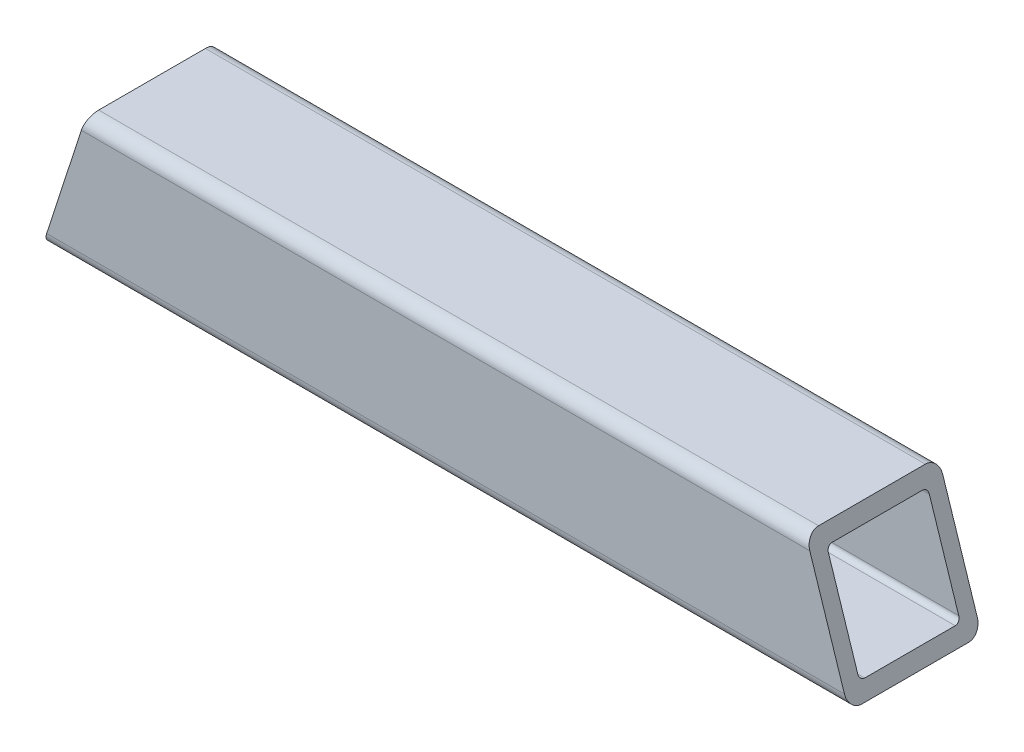
ISO-10303-21;
HEADER;
FILE_DESCRIPTION(('STEP AP214'),'2;1');
FILE_NAME('part.step','',(''),(''),'','','');
FILE_SCHEMA(('AUTOMOTIVE_DESIGN { 1 0 10303 214 1 1 1 1 }'));
ENDSEC;
DATA;
#1=APPLICATION_CONTEXT('core data for automotive mechanical design processes');
#2=APPLICATION_PROTOCOL_DEFINITION('international standard','automotive_design',2000,#1);
#3=PRODUCT_CONTEXT('',#1,'mechanical');
#4=PRODUCT('Part','Part','',(#3));
#5=PRODUCT_RELATED_PRODUCT_CATEGORY('part','',(#4));
#6=PRODUCT_DEFINITION_FORMATION('','',#4);
#7=PRODUCT_DEFINITION_CONTEXT('part definition',#1,'design');
#8=PRODUCT_DEFINITION('design','',#6,#7);
#9=PRODUCT_DEFINITION_SHAPE('','',#8);
#10=(LENGTH_UNIT() NAMED_UNIT(*) SI_UNIT(.MILLI.,.METRE.));
#11=(NAMED_UNIT(*) PLANE_ANGLE_UNIT() SI_UNIT($,.RADIAN.));
#12=(NAMED_UNIT(*) SI_UNIT($,.STERADIAN.) SOLID_ANGLE_UNIT());
#13=UNCERTAINTY_MEASURE_WITH_UNIT(LENGTH_MEASURE(1.E-05),#10,'distance_accuracy_value','');
#14=(GEOMETRIC_REPRESENTATION_CONTEXT(3) GLOBAL_UNCERTAINTY_ASSIGNED_CONTEXT((#13)) GLOBAL_UNIT_ASSIGNED_CONTEXT((#10,
#11,#12)) REPRESENTATION_CONTEXT('',''));
#15=CARTESIAN_POINT('',(0.,0.,0.));
#16=DIRECTION('',(0.,0.,1.));
#17=DIRECTION('',(1.,0.,0.));
#18=AXIS2_PLACEMENT_3D('',#15,#16,#17);
#19=CARTESIAN_POINT('',(-154.14,12.7,-12.7));
#20=DIRECTION('',(0.,0.,-1.));
#21=DIRECTION('',(0.,1.,0.));
#22=AXIS2_PLACEMENT_3D('',#19,#20,#21);
#23=PLANE('',#22);
#24=DIRECTION('',(1.,0.,0.));
#25=VECTOR('',#24,1.);
#26=CARTESIAN_POINT('',(-154.14,-10.2,-12.7));
#27=LINE('',#26,#25);
#28=CARTESIAN_POINT('',(-0.812299240582242,-10.2,-12.7));
#29=VERTEX_POINT('',#28);
#30=CARTESIAN_POINT('',(-153.327700759418,-10.2,-12.7));
#31=VERTEX_POINT('',#30);
#32=EDGE_CURVE('E163',#29,#31,#27,.F.);
#33=ORIENTED_EDGE('',*,*,#32,.T.);
#34=DIRECTION('',(0.309016994374949,0.951056516295153,0.));
#35=VECTOR('',#34,1.);
#36=CARTESIAN_POINT('',(-135.68850340442,44.087867308462,-12.7));
#37=LINE('',#36,#35);
#38=CARTESIAN_POINT('',(-146.699338956266,10.2,-12.7));
#39=VERTEX_POINT('',#38);
#40=EDGE_CURVE('E146',#31,#39,#37,.T.);
#41=ORIENTED_EDGE('',*,*,#40,.T.);
#42=DIRECTION('',(1.,0.,0.));
#43=VECTOR('',#42,1.);
#44=CARTESIAN_POINT('',(-154.14,10.2,-12.7));
#45=LINE('',#44,#43);
#46=CARTESIAN_POINT('',(-7.44066104373339,10.2,-12.7));
#47=VERTEX_POINT('',#46);
#48=EDGE_CURVE('E172',#39,#47,#45,.T.);
#49=ORIENTED_EDGE('',*,*,#48,.T.);
#50=DIRECTION('',(0.309016994374941,-0.951056516295156,0.));
#51=VECTOR('',#50,1.);
#52=CARTESIAN_POINT('',(-3.73243635205714,-1.21274208571903,-12.7));
#53=LINE('',#52,#51);
#54=EDGE_CURVE('E166',#47,#29,#53,.T.);
#55=ORIENTED_EDGE('',*,*,#54,.T.);
#56=EDGE_LOOP('',(#33,#41,#49,#55));
#57=FACE_BOUND('',#56,.T.);
#58=ADVANCED_FACE('F33',(#57),#23,.T.);
#59=CARTESIAN_POINT('',(-154.14,12.7,12.7));
#60=DIRECTION('',(0.,0.,1.));
#61=DIRECTION('',(0.,-1.,0.));
#62=AXIS2_PLACEMENT_3D('',#59,#60,#61);
#63=PLANE('',#62);
#64=DIRECTION('',(1.,0.,0.));
#65=VECTOR('',#64,1.);
#66=CARTESIAN_POINT('',(-154.14,10.2,12.7));
#67=LINE('',#66,#65);
#68=CARTESIAN_POINT('',(-7.44066104373339,10.2,12.7));
#69=VERTEX_POINT('',#68);
#70=CARTESIAN_POINT('',(-146.699338956266,10.2,12.7));
#71=VERTEX_POINT('',#70);
#72=EDGE_CURVE('E171',#69,#71,#67,.F.);
#73=ORIENTED_EDGE('',*,*,#72,.T.);
#74=DIRECTION('',(0.309016994374949,0.951056516295153,0.));
#75=VECTOR('',#74,1.);
#76=CARTESIAN_POINT('',(-135.68850340442,44.0878673084619,12.7));
#77=LINE('',#76,#75);
#78=CARTESIAN_POINT('',(-153.327700759418,-10.2,12.7));
#79=VERTEX_POINT('',#78);
#80=EDGE_CURVE('E156',#79,#71,#77,.T.);
#81=ORIENTED_EDGE('',*,*,#80,.F.);
#82=DIRECTION('',(1.,0.,0.));
#83=VECTOR('',#82,1.);
#84=CARTESIAN_POINT('',(-154.14,-10.2,12.7));
#85=LINE('',#84,#83);
#86=CARTESIAN_POINT('',(-0.812299240582243,-10.2,12.7));
#87=VERTEX_POINT('',#86);
#88=EDGE_CURVE('E175',#79,#87,#85,.T.);
#89=ORIENTED_EDGE('',*,*,#88,.T.);
#90=DIRECTION('',(0.309016994374941,-0.951056516295156,0.));
#91=VECTOR('',#90,1.);
#92=CARTESIAN_POINT('',(-3.73243635205714,-1.21274208571904,12.7));
#93=LINE('',#92,#91);
#94=EDGE_CURVE('E267',#69,#87,#93,.T.);
#95=ORIENTED_EDGE('',*,*,#94,.F.);
#96=EDGE_LOOP('',(#73,#81,#89,#95));
#97=FACE_BOUND('',#96,.T.);
#98=ADVANCED_FACE('F279',(#97),#63,.T.);
#99=CARTESIAN_POINT('',(-154.14,12.7,12.7));
#100=DIRECTION('',(0.,1.,0.));
#101=DIRECTION('',(0.,0.,1.));
#102=AXIS2_PLACEMENT_3D('',#99,#100,#101);
#103=PLANE('',#102);
#104=DIRECTION('',(1.,0.,0.));
#105=VECTOR('',#104,1.);
#106=CARTESIAN_POINT('',(-154.14,12.7,-10.2));
#107=LINE('',#106,#105);
#108=CARTESIAN_POINT('',(-8.25296028431564,12.7,-10.2));
#109=VERTEX_POINT('',#108);
#110=CARTESIAN_POINT('',(-145.887039715684,12.7,-10.2));
#111=VERTEX_POINT('',#110);
#112=EDGE_CURVE('E182',#109,#111,#107,.F.);
#113=ORIENTED_EDGE('',*,*,#112,.T.);
#114=DIRECTION('',(0.,0.,-1.));
#115=VECTOR('',#114,1.);
#116=CARTESIAN_POINT('',(-145.887039715684,12.7,12.7));
#117=LINE('',#116,#115);
#118=CARTESIAN_POINT('',(-145.887039715684,12.7,10.2));
#119=VERTEX_POINT('',#118);
#120=EDGE_CURVE('E299',#119,#111,#117,.T.);
#121=ORIENTED_EDGE('',*,*,#120,.F.);
#122=DIRECTION('',(1.,0.,0.));
#123=VECTOR('',#122,1.);
#124=CARTESIAN_POINT('',(-154.14,12.7,10.2));
#125=LINE('',#124,#123);
#126=CARTESIAN_POINT('',(-8.25296028431566,12.7,10.2));
#127=VERTEX_POINT('',#126);
#128=EDGE_CURVE('E56',#119,#127,#125,.T.);
#129=ORIENTED_EDGE('',*,*,#128,.T.);
#130=DIRECTION('',(0.,0.,-1.));
#131=VECTOR('',#130,1.);
#132=CARTESIAN_POINT('',(-8.25296028431564,12.7,12.7));
#133=LINE('',#132,#131);
#134=EDGE_CURVE('E220',#127,#109,#133,.T.);
#135=ORIENTED_EDGE('',*,*,#134,.T.);
#136=EDGE_LOOP('',(#113,#121,#129,#135));
#137=FACE_BOUND('',#136,.T.);
#138=ADVANCED_FACE('F272',(#137),#103,.T.);
#139=CARTESIAN_POINT('',(-154.14,-9.652,-9.652));
#140=DIRECTION('',(0.,0.,-1.));
#141=DIRECTION('',(-1.,0.,0.));
#142=AXIS2_PLACEMENT_3D('',#139,#140,#141);
#143=PLANE('',#142);
#144=DIRECTION('',(0.309016994374949,0.951056516295153,0.));
#145=VECTOR('',#144,1.);
#146=CARTESIAN_POINT('',(-153.244215275506,-9.94305810057259,-9.652));
#147=LINE('',#146,#145);
#148=CARTESIAN_POINT('',(-152.824725069649,-8.652,-9.652));
#149=VERTEX_POINT('',#148);
#150=CARTESIAN_POINT('',(-147.202314646035,8.652,-9.652));
#151=VERTEX_POINT('',#150);
#152=EDGE_CURVE('E284',#149,#151,#147,.T.);
#153=ORIENTED_EDGE('',*,*,#152,.F.);
#154=DIRECTION('',(1.,0.,0.));
#155=VECTOR('',#154,1.);
#156=CARTESIAN_POINT('',(0.,-8.652,-9.652));
#157=LINE('',#156,#155);
#158=CARTESIAN_POINT('',(-1.31527493035075,-8.652,-9.652));
#159=VERTEX_POINT('',#158);
#160=EDGE_CURVE('E188',#149,#159,#157,.T.);
#161=ORIENTED_EDGE('',*,*,#160,.T.);
#162=DIRECTION('',(0.309016994374941,-0.951056516295156,0.));
#163=VECTOR('',#162,1.);
#164=CARTESIAN_POINT('',(-15.6148449680159,35.3575512936075,-9.652));
#165=LINE('',#164,#163);
#166=CARTESIAN_POINT('',(-6.93768535396486,8.652,-9.652));
#167=VERTEX_POINT('',#166);
#168=EDGE_CURVE('E231',#167,#159,#165,.T.);
#169=ORIENTED_EDGE('',*,*,#168,.F.);
#170=DIRECTION('',(1.,0.,0.));
#171=VECTOR('',#170,1.);
#172=CARTESIAN_POINT('',(-154.14,8.652,-9.652));
#173=LINE('',#172,#171);
#174=EDGE_CURVE('E185',#167,#151,#173,.F.);
#175=ORIENTED_EDGE('',*,*,#174,.T.);
#176=EDGE_LOOP('',(#153,#161,#169,#175));
#177=FACE_BOUND('',#176,.T.);
#178=ADVANCED_FACE('F349',(#177),#143,.F.);
#179=CARTESIAN_POINT('',(-154.14,-9.652,9.652));
#180=DIRECTION('',(0.,-1.,0.));
#181=DIRECTION('',(0.,0.,-1.));
#182=AXIS2_PLACEMENT_3D('',#179,#180,#181);
#183=PLANE('',#182);
#184=DIRECTION('',(0.,0.,-1.));
#185=VECTOR('',#184,1.);
#186=CARTESIAN_POINT('',(-153.149644765882,-9.652,9.652));
#187=LINE('',#186,#185);
#188=CARTESIAN_POINT('',(-153.149644765882,-9.652,8.652));
#189=VERTEX_POINT('',#188);
#190=CARTESIAN_POINT('',(-153.149644765882,-9.652,-8.652));
#191=VERTEX_POINT('',#190);
#192=EDGE_CURVE('E294',#189,#191,#187,.T.);
#193=ORIENTED_EDGE('',*,*,#192,.F.);
#194=DIRECTION('',(1.,0.,0.));
#195=VECTOR('',#194,1.);
#196=CARTESIAN_POINT('',(0.,-9.652,8.652));
#197=LINE('',#196,#195);
#198=CARTESIAN_POINT('',(-0.990355234117847,-9.652,8.652));
#199=VERTEX_POINT('',#198);
#200=EDGE_CURVE('E190',#189,#199,#197,.T.);
#201=ORIENTED_EDGE('',*,*,#200,.T.);
#202=DIRECTION('',(0.,0.,1.));
#203=VECTOR('',#202,1.);
#204=CARTESIAN_POINT('',(-0.990355234117862,-9.652,9.652));
#205=LINE('',#204,#203);
#206=CARTESIAN_POINT('',(-0.990355234117861,-9.652,-8.652));
#207=VERTEX_POINT('',#206);
#208=EDGE_CURVE('E219',#207,#199,#205,.T.);
#209=ORIENTED_EDGE('',*,*,#208,.F.);
#210=DIRECTION('',(1.,0.,0.));
#211=VECTOR('',#210,1.);
#212=CARTESIAN_POINT('',(-154.14,-9.652,-8.652));
#213=LINE('',#212,#211);
#214=EDGE_CURVE('E192',#207,#191,#213,.F.);
#215=ORIENTED_EDGE('',*,*,#214,.T.);
#216=EDGE_LOOP('',(#193,#201,#209,#215));
#217=FACE_BOUND('',#216,.T.);
#218=ADVANCED_FACE('F306',(#217),#183,.F.);
#219=CARTESIAN_POINT('',(-154.14,-9.652,9.652));
#220=DIRECTION('',(0.,0.,1.));
#221=DIRECTION('',(1.,0.,0.));
#222=AXIS2_PLACEMENT_3D('',#219,#220,#221);
#223=PLANE('',#222);
#224=DIRECTION('',(-0.309016994374949,-0.951056516295153,0.));
#225=VECTOR('',#224,1.);
#226=CARTESIAN_POINT('',(-153.244215275506,-9.94305810057259,9.652));
#227=LINE('',#226,#225);
#228=CARTESIAN_POINT('',(-147.202314646035,8.652,9.652));
#229=VERTEX_POINT('',#228);
#230=CARTESIAN_POINT('',(-152.824725069649,-8.652,9.652));
#231=VERTEX_POINT('',#230);
#232=EDGE_CURVE('E48',#229,#231,#227,.T.);
#233=ORIENTED_EDGE('',*,*,#232,.F.);
#234=DIRECTION('',(1.,0.,0.));
#235=VECTOR('',#234,1.);
#236=CARTESIAN_POINT('',(0.,8.652,9.652));
#237=LINE('',#236,#235);
#238=CARTESIAN_POINT('',(-6.93768535396486,8.652,9.652));
#239=VERTEX_POINT('',#238);
#240=EDGE_CURVE('E41',#229,#239,#237,.T.);
#241=ORIENTED_EDGE('',*,*,#240,.T.);
#242=DIRECTION('',(-0.309016994374941,0.951056516295156,0.));
#243=VECTOR('',#242,1.);
#244=CARTESIAN_POINT('',(-15.6148449680159,35.3575512936075,9.652));
#245=LINE('',#244,#243);
#246=CARTESIAN_POINT('',(-1.31527493035075,-8.652,9.652));
#247=VERTEX_POINT('',#246);
#248=EDGE_CURVE('E207',#247,#239,#245,.T.);
#249=ORIENTED_EDGE('',*,*,#248,.F.);
#250=DIRECTION('',(1.,0.,0.));
#251=VECTOR('',#250,1.);
#252=CARTESIAN_POINT('',(-154.14,-8.652,9.652));
#253=LINE('',#252,#251);
#254=EDGE_CURVE('E200',#247,#231,#253,.F.);
#255=ORIENTED_EDGE('',*,*,#254,.T.);
#256=EDGE_LOOP('',(#233,#241,#249,#255));
#257=FACE_BOUND('',#256,.T.);
#258=ADVANCED_FACE('F206',(#257),#223,.F.);
#259=CARTESIAN_POINT('',(-154.14,9.652,9.652));
#260=DIRECTION('',(0.,1.,0.));
#261=DIRECTION('',(0.,0.,1.));
#262=AXIS2_PLACEMENT_3D('',#259,#260,#261);
#263=PLANE('',#262);
#264=DIRECTION('',(0.,0.,1.));
#265=VECTOR('',#264,1.);
#266=CARTESIAN_POINT('',(-146.877394949802,9.652,9.652));
#267=LINE('',#266,#265);
#268=CARTESIAN_POINT('',(-146.877394949802,9.652,-8.652));
#269=VERTEX_POINT('',#268);
#270=CARTESIAN_POINT('',(-146.877394949802,9.652,8.652));
#271=VERTEX_POINT('',#270);
#272=EDGE_CURVE('E288',#269,#271,#267,.T.);
#273=ORIENTED_EDGE('',*,*,#272,.F.);
#274=DIRECTION('',(1.,0.,0.));
#275=VECTOR('',#274,1.);
#276=CARTESIAN_POINT('',(0.,9.652,-8.652));
#277=LINE('',#276,#275);
#278=CARTESIAN_POINT('',(-7.26260505019774,9.652,-8.652));
#279=VERTEX_POINT('',#278);
#280=EDGE_CURVE('E198',#269,#279,#277,.T.);
#281=ORIENTED_EDGE('',*,*,#280,.T.);
#282=DIRECTION('',(0.,0.,-1.));
#283=VECTOR('',#282,1.);
#284=CARTESIAN_POINT('',(-7.26260505019774,9.652,9.652));
#285=LINE('',#284,#283);
#286=CARTESIAN_POINT('',(-7.26260505019774,9.652,8.652));
#287=VERTEX_POINT('',#286);
#288=EDGE_CURVE('E226',#287,#279,#285,.T.);
#289=ORIENTED_EDGE('',*,*,#288,.F.);
#290=DIRECTION('',(1.,0.,0.));
#291=VECTOR('',#290,1.);
#292=CARTESIAN_POINT('',(-154.14,9.652,8.652));
#293=LINE('',#292,#291);
#294=EDGE_CURVE('E195',#287,#271,#293,.F.);
#295=ORIENTED_EDGE('',*,*,#294,.T.);
#296=EDGE_LOOP('',(#273,#281,#289,#295));
#297=FACE_BOUND('',#296,.T.);
#298=ADVANCED_FACE('F326',(#297),#263,.F.);
#299=CARTESIAN_POINT('',(-154.14,-10.2,-10.2));
#300=DIRECTION('',(1.,0.,0.));
#301=DIRECTION('',(0.,0.,-1.));
#302=AXIS2_PLACEMENT_3D('',#299,#300,#301);
#303=CYLINDRICAL_SURFACE('',#302,2.5);
#304=DIRECTION('',(1.,0.,0.));
#305=VECTOR('',#304,1.);
#306=CARTESIAN_POINT('',(-154.14,-12.7,-10.2));
#307=LINE('',#306,#305);
#308=CARTESIAN_POINT('',(-154.14,-12.7,-10.2));
#309=VERTEX_POINT('',#308);
#310=CARTESIAN_POINT('',(0.,-12.7,-10.2));
#311=VERTEX_POINT('',#310);
#312=EDGE_CURVE('E165',#309,#311,#307,.T.);
#313=ORIENTED_EDGE('',*,*,#312,.F.);
#314=CARTESIAN_POINT('',(-153.327700759418,-10.2,-10.2));
#315=DIRECTION('',(-0.951056516295153,0.309016994374948,0.));
#316=DIRECTION('',(0.309016994374949,0.951056516295153,0.));
#317=AXIS2_PLACEMENT_3D('',#314,#315,#316);
#318=ELLIPSE('',#317,2.62865556059567,2.5);
#319=EDGE_CURVE('E149',#309,#31,#318,.F.);
#320=ORIENTED_EDGE('',*,*,#319,.T.);
#321=ORIENTED_EDGE('',*,*,#32,.F.);
#322=CARTESIAN_POINT('',(-0.812299240582237,-10.2,-10.2));
#323=DIRECTION('',(0.951056516295156,0.309016994374941,0.));
#324=DIRECTION('',(0.309016994374941,-0.951056516295156,0.));
#325=AXIS2_PLACEMENT_3D('',#322,#323,#324);
#326=ELLIPSE('',#325,2.62865556059566,2.5);
#327=EDGE_CURVE('E245',#29,#311,#326,.F.);
#328=ORIENTED_EDGE('',*,*,#327,.T.);
#329=EDGE_LOOP('',(#313,#320,#321,#328));
#330=FACE_BOUND('',#329,.T.);
#331=ADVANCED_FACE('F161',(#330),#303,.T.);
#332=CARTESIAN_POINT('',(-154.14,-10.2,10.2));
#333=DIRECTION('',(1.,0.,0.));
#334=DIRECTION('',(0.,0.,-1.));
#335=AXIS2_PLACEMENT_3D('',#332,#333,#334);
#336=CYLINDRICAL_SURFACE('',#335,2.5);
#337=ORIENTED_EDGE('',*,*,#88,.F.);
#338=CARTESIAN_POINT('',(-153.327700759418,-10.2,10.2));
#339=DIRECTION('',(-0.951056516295153,0.309016994374948,0.));
#340=DIRECTION('',(0.309016994374949,0.951056516295153,0.));
#341=AXIS2_PLACEMENT_3D('',#338,#339,#340);
#342=ELLIPSE('',#341,2.62865556059567,2.5);
#343=CARTESIAN_POINT('',(-154.14,-12.7,10.2));
#344=VERTEX_POINT('',#343);
#345=EDGE_CURVE('E167',#79,#344,#342,.F.);
#346=ORIENTED_EDGE('',*,*,#345,.T.);
#347=DIRECTION('',(1.,0.,0.));
#348=VECTOR('',#347,1.);
#349=CARTESIAN_POINT('',(-154.14,-12.7,10.2));
#350=LINE('',#349,#348);
#351=CARTESIAN_POINT('',(0.,-12.7,10.2));
#352=VERTEX_POINT('',#351);
#353=EDGE_CURVE('E250',#352,#344,#350,.F.);
#354=ORIENTED_EDGE('',*,*,#353,.F.);
#355=CARTESIAN_POINT('',(-0.812299240582237,-10.2,10.2));
#356=DIRECTION('',(0.951056516295156,0.309016994374941,0.));
#357=DIRECTION('',(0.309016994374941,-0.951056516295156,0.));
#358=AXIS2_PLACEMENT_3D('',#355,#356,#357);
#359=ELLIPSE('',#358,2.62865556059566,2.5);
#360=EDGE_CURVE('E242',#352,#87,#359,.F.);
#361=ORIENTED_EDGE('',*,*,#360,.T.);
#362=EDGE_LOOP('',(#337,#346,#354,#361));
#363=FACE_BOUND('',#362,.T.);
#364=ADVANCED_FACE('F261',(#363),#336,.T.);
#365=CARTESIAN_POINT('',(-154.14,10.2,-10.2));
#366=DIRECTION('',(1.,0.,0.));
#367=DIRECTION('',(0.,0.,-1.));
#368=AXIS2_PLACEMENT_3D('',#365,#366,#367);
#369=CYLINDRICAL_SURFACE('',#368,2.5);
#370=ORIENTED_EDGE('',*,*,#48,.F.);
#371=CARTESIAN_POINT('',(-146.699338956266,10.2,-10.2));
#372=DIRECTION('',(-0.951056516295153,0.309016994374948,0.));
#373=DIRECTION('',(0.309016994374949,0.951056516295153,0.));
#374=AXIS2_PLACEMENT_3D('',#371,#372,#373);
#375=ELLIPSE('',#374,2.62865556059567,2.5);
#376=EDGE_CURVE('E152',#39,#111,#375,.F.);
#377=ORIENTED_EDGE('',*,*,#376,.T.);
#378=ORIENTED_EDGE('',*,*,#112,.F.);
#379=CARTESIAN_POINT('',(-7.44066104373339,10.2,-10.2));
#380=DIRECTION('',(0.951056516295156,0.309016994374941,0.));
#381=DIRECTION('',(0.309016994374941,-0.951056516295156,0.));
#382=AXIS2_PLACEMENT_3D('',#379,#380,#381);
#383=ELLIPSE('',#382,2.62865556059566,2.5);
#384=EDGE_CURVE('E239',#109,#47,#383,.F.);
#385=ORIENTED_EDGE('',*,*,#384,.T.);
#386=EDGE_LOOP('',(#370,#377,#378,#385));
#387=FACE_BOUND('',#386,.T.);
#388=ADVANCED_FACE('F275',(#387),#369,.T.);
#389=CARTESIAN_POINT('',(-154.14,10.2,10.2));
#390=DIRECTION('',(1.,0.,0.));
#391=DIRECTION('',(0.,0.,-1.));
#392=AXIS2_PLACEMENT_3D('',#389,#390,#391);
#393=CYLINDRICAL_SURFACE('',#392,2.5);
#394=ORIENTED_EDGE('',*,*,#128,.F.);
#395=CARTESIAN_POINT('',(-146.699338956266,10.2,10.2));
#396=DIRECTION('',(-0.951056516295153,0.309016994374948,0.));
#397=DIRECTION('',(0.309016994374949,0.951056516295153,0.));
#398=AXIS2_PLACEMENT_3D('',#395,#396,#397);
#399=ELLIPSE('',#398,2.62865556059567,2.5);
#400=EDGE_CURVE('E263',#119,#71,#399,.F.);
#401=ORIENTED_EDGE('',*,*,#400,.T.);
#402=ORIENTED_EDGE('',*,*,#72,.F.);
#403=CARTESIAN_POINT('',(-7.44066104373339,10.2,10.2));
#404=DIRECTION('',(0.951056516295156,0.309016994374941,0.));
#405=DIRECTION('',(0.309016994374941,-0.951056516295156,0.));
#406=AXIS2_PLACEMENT_3D('',#403,#404,#405);
#407=ELLIPSE('',#406,2.62865556059566,2.5);
#408=EDGE_CURVE('E236',#69,#127,#407,.F.);
#409=ORIENTED_EDGE('',*,*,#408,.T.);
#410=EDGE_LOOP('',(#394,#401,#402,#409));
#411=FACE_BOUND('',#410,.T.);
#412=ADVANCED_FACE('F282',(#411),#393,.T.);
#413=CARTESIAN_POINT('',(-154.14,-8.652,-8.652));
#414=DIRECTION('',(-1.,0.,0.));
#415=DIRECTION('',(0.,0.,1.));
#416=AXIS2_PLACEMENT_3D('',#413,#414,#415);
#417=CYLINDRICAL_SURFACE('',#416,1.);
#418=CARTESIAN_POINT('',(-152.824725069649,-8.652,-8.652));
#419=DIRECTION('',(-0.951056516295153,0.309016994374948,0.));
#420=DIRECTION('',(-0.309016994374949,-0.951056516295153,0.));
#421=AXIS2_PLACEMENT_3D('',#418,#419,#420);
#422=ELLIPSE('',#421,1.05146222423827,1.);
#423=EDGE_CURVE('E290',#191,#149,#422,.F.);
#424=ORIENTED_EDGE('',*,*,#423,.F.);
#425=ORIENTED_EDGE('',*,*,#214,.F.);
#426=CARTESIAN_POINT('',(-1.31527493035075,-8.652,-8.652));
#427=DIRECTION('',(0.951056516295156,0.309016994374941,0.));
#428=DIRECTION('',(-0.309016994374941,0.951056516295156,0.));
#429=AXIS2_PLACEMENT_3D('',#426,#427,#428);
#430=ELLIPSE('',#429,1.05146222423827,1.);
#431=EDGE_CURVE('E224',#159,#207,#430,.F.);
#432=ORIENTED_EDGE('',*,*,#431,.F.);
#433=ORIENTED_EDGE('',*,*,#160,.F.);
#434=EDGE_LOOP('',(#424,#425,#432,#433));
#435=FACE_BOUND('',#434,.T.);
#436=ADVANCED_FACE('F333',(#435),#417,.F.);
#437=CARTESIAN_POINT('',(-154.14,8.652,-8.652));
#438=DIRECTION('',(-1.,0.,0.));
#439=DIRECTION('',(0.,0.,1.));
#440=AXIS2_PLACEMENT_3D('',#437,#438,#439);
#441=CYLINDRICAL_SURFACE('',#440,1.);
#442=CARTESIAN_POINT('',(-147.202314646035,8.652,-8.652));
#443=DIRECTION('',(-0.951056516295153,0.309016994374948,0.));
#444=DIRECTION('',(-0.309016994374949,-0.951056516295153,0.));
#445=AXIS2_PLACEMENT_3D('',#442,#443,#444);
#446=ELLIPSE('',#445,1.05146222423827,1.);
#447=EDGE_CURVE('E283',#151,#269,#446,.F.);
#448=ORIENTED_EDGE('',*,*,#447,.F.);
#449=ORIENTED_EDGE('',*,*,#174,.F.);
#450=CARTESIAN_POINT('',(-6.93768535396486,8.652,-8.652));
#451=DIRECTION('',(0.951056516295156,0.309016994374941,0.));
#452=DIRECTION('',(-0.309016994374941,0.951056516295156,0.));
#453=AXIS2_PLACEMENT_3D('',#450,#451,#452);
#454=ELLIPSE('',#453,1.05146222423827,1.);
#455=EDGE_CURVE('E234',#279,#167,#454,.F.);
#456=ORIENTED_EDGE('',*,*,#455,.F.);
#457=ORIENTED_EDGE('',*,*,#280,.F.);
#458=EDGE_LOOP('',(#448,#449,#456,#457));
#459=FACE_BOUND('',#458,.T.);
#460=ADVANCED_FACE('F315',(#459),#441,.F.);
#461=CARTESIAN_POINT('',(-154.14,8.652,8.652));
#462=DIRECTION('',(-1.,0.,0.));
#463=DIRECTION('',(0.,0.,1.));
#464=AXIS2_PLACEMENT_3D('',#461,#462,#463);
#465=CYLINDRICAL_SURFACE('',#464,1.);
#466=CARTESIAN_POINT('',(-147.202314646035,8.652,8.652));
#467=DIRECTION('',(-0.951056516295153,0.309016994374948,0.));
#468=DIRECTION('',(-0.309016994374949,-0.951056516295153,0.));
#469=AXIS2_PLACEMENT_3D('',#466,#467,#468);
#470=ELLIPSE('',#469,1.05146222423827,1.);
#471=EDGE_CURVE('E292',#271,#229,#470,.F.);
#472=ORIENTED_EDGE('',*,*,#471,.F.);
#473=ORIENTED_EDGE('',*,*,#294,.F.);
#474=CARTESIAN_POINT('',(-6.93768535396486,8.652,8.652));
#475=DIRECTION('',(0.951056516295156,0.309016994374941,0.));
#476=DIRECTION('',(-0.309016994374941,0.951056516295156,0.));
#477=AXIS2_PLACEMENT_3D('',#474,#475,#476);
#478=ELLIPSE('',#477,1.05146222423827,1.);
#479=EDGE_CURVE('E215',#239,#287,#478,.F.);
#480=ORIENTED_EDGE('',*,*,#479,.F.);
#481=ORIENTED_EDGE('',*,*,#240,.F.);
#482=EDGE_LOOP('',(#472,#473,#480,#481));
#483=FACE_BOUND('',#482,.T.);
#484=ADVANCED_FACE('F223',(#483),#465,.F.);
#485=CARTESIAN_POINT('',(-154.14,-8.652,8.652));
#486=DIRECTION('',(-1.,0.,0.));
#487=DIRECTION('',(0.,0.,1.));
#488=AXIS2_PLACEMENT_3D('',#485,#486,#487);
#489=CYLINDRICAL_SURFACE('',#488,1.);
#490=CARTESIAN_POINT('',(-152.824725069649,-8.652,8.652));
#491=DIRECTION('',(-0.951056516295153,0.309016994374948,0.));
#492=DIRECTION('',(-0.309016994374949,-0.951056516295153,0.));
#493=AXIS2_PLACEMENT_3D('',#490,#491,#492);
#494=ELLIPSE('',#493,1.05146222423827,1.);
#495=EDGE_CURVE('E297',#231,#189,#494,.F.);
#496=ORIENTED_EDGE('',*,*,#495,.F.);
#497=ORIENTED_EDGE('',*,*,#254,.F.);
#498=CARTESIAN_POINT('',(-1.31527493035075,-8.652,8.652));
#499=DIRECTION('',(0.951056516295156,0.309016994374941,0.));
#500=DIRECTION('',(-0.309016994374941,0.951056516295156,0.));
#501=AXIS2_PLACEMENT_3D('',#498,#499,#500);
#502=ELLIPSE('',#501,1.05146222423827,1.);
#503=EDGE_CURVE('E11',#199,#247,#502,.F.);
#504=ORIENTED_EDGE('',*,*,#503,.F.);
#505=ORIENTED_EDGE('',*,*,#200,.F.);
#506=EDGE_LOOP('',(#496,#497,#504,#505));
#507=FACE_BOUND('',#506,.T.);
#508=ADVANCED_FACE('F35',(#507),#489,.F.);
#509=CARTESIAN_POINT('',(-154.14,-12.7,12.7));
#510=DIRECTION('',(0.,-1.,0.));
#511=DIRECTION('',(0.,0.,-1.));
#512=AXIS2_PLACEMENT_3D('',#509,#510,#511);
#513=PLANE('',#512);
#514=DIRECTION('',(0.,0.,-1.));
#515=VECTOR('',#514,1.);
#516=CARTESIAN_POINT('',(-154.14,-12.7,12.7));
#517=LINE('',#516,#515);
#518=EDGE_CURVE('E248',#344,#309,#517,.T.);
#519=ORIENTED_EDGE('',*,*,#518,.T.);
#520=ORIENTED_EDGE('',*,*,#312,.T.);
#521=DIRECTION('',(0.,0.,-1.));
#522=VECTOR('',#521,1.);
#523=CARTESIAN_POINT('',(0.,-12.7,12.7));
#524=LINE('',#523,#522);
#525=EDGE_CURVE('E247',#352,#311,#524,.T.);
#526=ORIENTED_EDGE('',*,*,#525,.F.);
#527=ORIENTED_EDGE('',*,*,#353,.T.);
#528=EDGE_LOOP('',(#519,#520,#526,#527));
#529=FACE_BOUND('',#528,.T.);
#530=ADVANCED_FACE('F255',(#529),#513,.T.);
#531=CARTESIAN_POINT('',(-3.73243635205714,-1.21274208571904,12.7));
#532=DIRECTION('',(0.951056516295156,0.309016994374941,0.));
#533=DIRECTION('',(-0.309016994374941,0.951056516295156,0.));
#534=AXIS2_PLACEMENT_3D('',#531,#532,#533);
#535=PLANE('',#534);
#536=ORIENTED_EDGE('',*,*,#54,.F.);
#537=ORIENTED_EDGE('',*,*,#384,.F.);
#538=ORIENTED_EDGE('',*,*,#134,.F.);
#539=ORIENTED_EDGE('',*,*,#408,.F.);
#540=ORIENTED_EDGE('',*,*,#94,.T.);
#541=ORIENTED_EDGE('',*,*,#360,.F.);
#542=ORIENTED_EDGE('',*,*,#525,.T.);
#543=ORIENTED_EDGE('',*,*,#327,.F.);
#544=EDGE_LOOP('',(#536,#537,#538,#539,#540,#541,#542,#543));
#545=FACE_BOUND('',#544,.T.);
#546=ORIENTED_EDGE('',*,*,#455,.T.);
#547=ORIENTED_EDGE('',*,*,#168,.T.);
#548=ORIENTED_EDGE('',*,*,#431,.T.);
#549=ORIENTED_EDGE('',*,*,#208,.T.);
#550=ORIENTED_EDGE('',*,*,#503,.T.);
#551=ORIENTED_EDGE('',*,*,#248,.T.);
#552=ORIENTED_EDGE('',*,*,#479,.T.);
#553=ORIENTED_EDGE('',*,*,#288,.T.);
#554=EDGE_LOOP('',(#546,#547,#548,#549,#550,#551,#552,#553));
#555=FACE_BOUND('',#554,.T.);
#556=ADVANCED_FACE('F213',(#545,#555),#535,.T.);
#557=CARTESIAN_POINT('',(-135.68850340442,44.0878673084619,12.7));
#558=DIRECTION('',(-0.951056516295153,0.309016994374948,0.));
#559=DIRECTION('',(-0.309016994374949,-0.951056516295153,0.));
#560=AXIS2_PLACEMENT_3D('',#557,#558,#559);
#561=PLANE('',#560);
#562=ORIENTED_EDGE('',*,*,#518,.F.);
#563=ORIENTED_EDGE('',*,*,#345,.F.);
#564=ORIENTED_EDGE('',*,*,#80,.T.);
#565=ORIENTED_EDGE('',*,*,#400,.F.);
#566=ORIENTED_EDGE('',*,*,#120,.T.);
#567=ORIENTED_EDGE('',*,*,#376,.F.);
#568=ORIENTED_EDGE('',*,*,#40,.F.);
#569=ORIENTED_EDGE('',*,*,#319,.F.);
#570=EDGE_LOOP('',(#562,#563,#564,#565,#566,#567,#568,#569));
#571=FACE_BOUND('',#570,.T.);
#572=ORIENTED_EDGE('',*,*,#447,.T.);
#573=ORIENTED_EDGE('',*,*,#272,.T.);
#574=ORIENTED_EDGE('',*,*,#471,.T.);
#575=ORIENTED_EDGE('',*,*,#232,.T.);
#576=ORIENTED_EDGE('',*,*,#495,.T.);
#577=ORIENTED_EDGE('',*,*,#192,.T.);
#578=ORIENTED_EDGE('',*,*,#423,.T.);
#579=ORIENTED_EDGE('',*,*,#152,.T.);
#580=EDGE_LOOP('',(#572,#573,#574,#575,#576,#577,#578,#579));
#581=FACE_BOUND('',#580,.T.);
#582=ADVANCED_FACE('F148',(#571,#581),#561,.T.);
#583=CLOSED_SHELL('',(#58,#98,#138,#178,#218,#258,#298,#331,#364,#388,#412,#436,#460,#484,#508,
#530,#556,#582));
#584=MANIFOLD_SOLID_BREP('B2',#583);
#585=ADVANCED_BREP_SHAPE_REPRESENTATION('',(#18,#584),#14);
#586=SHAPE_DEFINITION_REPRESENTATION(#9,#585);
ENDSEC;
END-ISO-10303-21;
